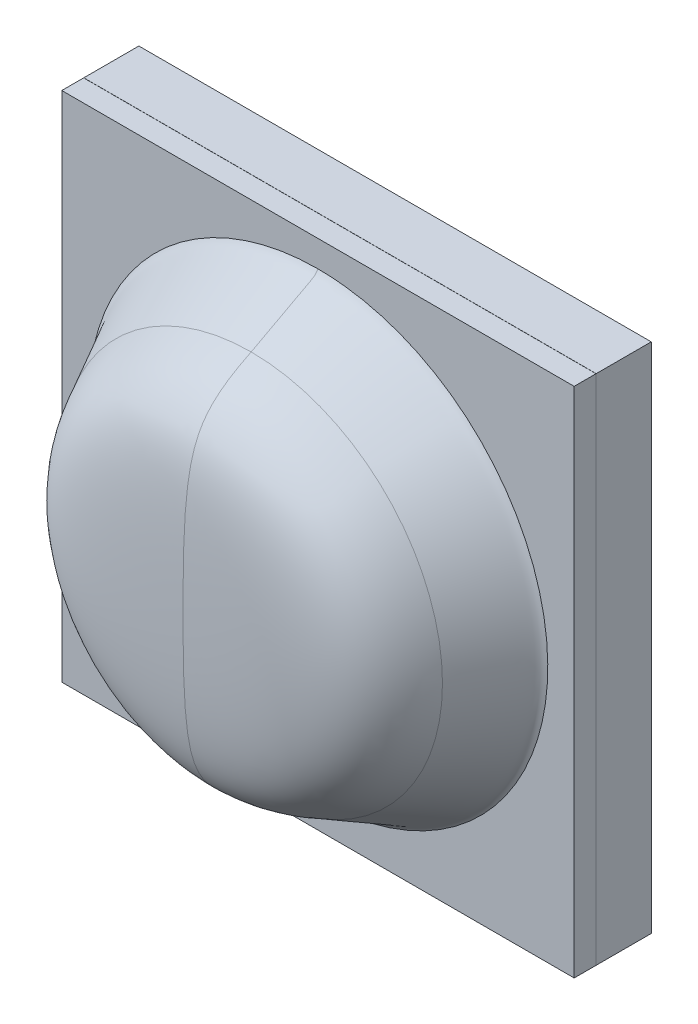
ISO-10303-21;
HEADER;
FILE_DESCRIPTION(('STEP AP214'),'2;1');
FILE_NAME('part.step','',(''),(''),'','','');
FILE_SCHEMA(('AUTOMOTIVE_DESIGN { 1 0 10303 214 1 1 1 1 }'));
ENDSEC;
DATA;
#1=APPLICATION_CONTEXT('core data for automotive mechanical design processes');
#2=APPLICATION_PROTOCOL_DEFINITION('international standard','automotive_design',2000,#1);
#3=PRODUCT_CONTEXT('',#1,'mechanical');
#4=PRODUCT('Part','Part','',(#3));
#5=PRODUCT_RELATED_PRODUCT_CATEGORY('part','',(#4));
#6=PRODUCT_DEFINITION_FORMATION('','',#4);
#7=PRODUCT_DEFINITION_CONTEXT('part definition',#1,'design');
#8=PRODUCT_DEFINITION('design','',#6,#7);
#9=PRODUCT_DEFINITION_SHAPE('','',#8);
#10=(LENGTH_UNIT() NAMED_UNIT(*) SI_UNIT(.MILLI.,.METRE.));
#11=(NAMED_UNIT(*) PLANE_ANGLE_UNIT() SI_UNIT($,.RADIAN.));
#12=(NAMED_UNIT(*) SI_UNIT($,.STERADIAN.) SOLID_ANGLE_UNIT());
#13=UNCERTAINTY_MEASURE_WITH_UNIT(LENGTH_MEASURE(1.E-05),#10,'distance_accuracy_value','');
#14=(GEOMETRIC_REPRESENTATION_CONTEXT(3) GLOBAL_UNCERTAINTY_ASSIGNED_CONTEXT((#13)) GLOBAL_UNIT_ASSIGNED_CONTEXT((#10,
#11,#12)) REPRESENTATION_CONTEXT('',''));
#15=CARTESIAN_POINT('',(0.,0.,0.));
#16=DIRECTION('',(0.,0.,1.));
#17=DIRECTION('',(1.,0.,0.));
#18=AXIS2_PLACEMENT_3D('',#15,#16,#17);
#19=CARTESIAN_POINT('',(0.,0.,1.55299));
#20=CARTESIAN_POINT('',(0.,0.,1.55299));
#21=CARTESIAN_POINT('',(0.,0.,1.55299));
#22=CARTESIAN_POINT('',(0.,0.,1.55299));
#23=CARTESIAN_POINT('',(0.,1.156,1.55299));
#24=CARTESIAN_POINT('',(-2.312,1.156,1.55299));
#25=CARTESIAN_POINT('',(-2.312,-1.156,1.55299));
#26=CARTESIAN_POINT('',(0.,-1.156,1.55299));
#27=CARTESIAN_POINT('',(0.,1.4,1.05299));
#28=CARTESIAN_POINT('',(-2.8,1.4,1.05299));
#29=CARTESIAN_POINT('',(-2.8,-1.4,1.05299));
#30=CARTESIAN_POINT('',(0.,-1.4,1.05299));
#31=(BOUNDED_SURFACE() B_SPLINE_SURFACE(2,3,((#19,#20,#21,#22),(#23,#24,#25,#26),(#27,#28,#29,
#30)),.UNSPECIFIED.,.F.,.F.,.F.) B_SPLINE_SURFACE_WITH_KNOTS((3,3),(4,4),(-1.,0.),(0.,1.),
.UNSPECIFIED.) GEOMETRIC_REPRESENTATION_ITEM() RATIONAL_B_SPLINE_SURFACE(((1.,0.333333333333334,
0.333333333333334,1.),(1.94117647058824,0.647058823529413,0.647058823529413,1.94117647058824),
(1.,0.333333333333334,0.333333333333334,1.))) REPRESENTATION_ITEM('') SURFACE());
#32=CARTESIAN_POINT('',(0.,0.,1.55299));
#33=CARTESIAN_POINT('',(0.,-1.156,1.55299));
#34=CARTESIAN_POINT('',(0.,-1.4,1.053));
#35=(BOUNDED_CURVE() B_SPLINE_CURVE(2,(#32,#33,#34),.UNSPECIFIED.,.F.,
.F.) B_SPLINE_CURVE_WITH_KNOTS((3,3),(-1.,0.),
.UNSPECIFIED.) CURVE() GEOMETRIC_REPRESENTATION_ITEM() RATIONAL_B_SPLINE_CURVE((1.,
1.94117647058824,1.)) REPRESENTATION_ITEM(''));
#36=CARTESIAN_POINT('',(0.,0.,1.55299));
#37=VERTEX_POINT('',#36);
#38=CARTESIAN_POINT('',(0.,-1.4,1.053));
#39=VERTEX_POINT('',#38);
#40=EDGE_CURVE('E197',#37,#39,#35,.T.);
#41=CARTESIAN_POINT('',(0.,0.,1.55299));
#42=CARTESIAN_POINT('',(0.,1.156,1.55299));
#43=CARTESIAN_POINT('',(0.,1.4,1.053));
#44=(BOUNDED_CURVE() B_SPLINE_CURVE(2,(#41,#42,#43),.UNSPECIFIED.,.F.,
.F.) B_SPLINE_CURVE_WITH_KNOTS((3,3),(-1.,0.),
.UNSPECIFIED.) CURVE() GEOMETRIC_REPRESENTATION_ITEM() RATIONAL_B_SPLINE_CURVE((1.,
1.94117647058824,1.)) REPRESENTATION_ITEM(''));
#45=CARTESIAN_POINT('',(0.,1.4,1.053));
#46=VERTEX_POINT('',#45);
#47=EDGE_CURVE('E207',#37,#46,#44,.T.);
#48=CARTESIAN_POINT('',(0.,0.,1.053));
#49=DIRECTION('',(0.,0.,-1.));
#50=DIRECTION('',(0.,1.,0.));
#51=AXIS2_PLACEMENT_3D('',#48,#49,#50);
#52=CIRCLE('',#51,1.4);
#53=EDGE_CURVE('E10',#39,#46,#52,.T.);
#54=ORIENTED_EDGE('',*,*,#40,.F.);
#55=ORIENTED_EDGE('',*,*,#47,.T.);
#56=ORIENTED_EDGE('',*,*,#53,.F.);
#57=EDGE_LOOP('',(#54,#55,#56));
#58=FACE_BOUND('',#57,.T.);
#59=ADVANCED_FACE('F15',(#58),#31,.T.);
#60=CARTESIAN_POINT('',(0.,1.4,1.053));
#61=CARTESIAN_POINT('',(-2.8,1.4,1.053));
#62=CARTESIAN_POINT('',(-2.8,-1.4,1.053));
#63=CARTESIAN_POINT('',(0.,-1.4,1.053));
#64=CARTESIAN_POINT('',(0.,1.64871701198194,0.585412017473941));
#65=CARTESIAN_POINT('',(-3.29743402396389,1.64871701198195,0.585412017473941));
#66=CARTESIAN_POINT('',(-3.29743402396389,-1.64871701198195,0.585412017473941));
#67=CARTESIAN_POINT('',(0.,-1.64871701198194,0.585412017473941));
#68=CARTESIAN_POINT('',(0.,1.68189867190232,0.564155041236885));
#69=CARTESIAN_POINT('',(-3.36379734380464,1.68189867190232,0.564155041236885));
#70=CARTESIAN_POINT('',(-3.36379734380464,-1.68189867190232,0.564155041236885));
#71=CARTESIAN_POINT('',(0.,-1.68189867190232,0.564155041236885));
#72=(BOUNDED_SURFACE() B_SPLINE_SURFACE(2,3,((#60,#61,#62,#63),(#64,#65,#66,#67),(#68,#69,#70,
#71)),.UNSPECIFIED.,.F.,.F.,.F.) B_SPLINE_SURFACE_WITH_KNOTS((3,3),(4,4),(-1.,
-0.0364496165242492),(0.,1.),
.UNSPECIFIED.) GEOMETRIC_REPRESENTATION_ITEM() RATIONAL_B_SPLINE_SURFACE(((1.,0.333333333333334,
0.333333333333334,1.),(7.10248576201309,2.36749525400436,2.36749525400436,7.10248576201309),
(1.44486653174013,0.481622177246712,0.481622177246712,1.44486653174013))) REPRESENTATION_ITEM('') SURFACE());
#73=CARTESIAN_POINT('',(0.,-1.4,1.053));
#74=CARTESIAN_POINT('',(0.,-1.64871701198195,0.585412017473942));
#75=CARTESIAN_POINT('',(0.,-1.68189867190232,0.564155041236885));
#76=(BOUNDED_CURVE() B_SPLINE_CURVE(2,(#73,#74,#75),.UNSPECIFIED.,.F.,
.F.) B_SPLINE_CURVE_WITH_KNOTS((3,3),(-1.,-0.0364496165242487),
.UNSPECIFIED.) CURVE() GEOMETRIC_REPRESENTATION_ITEM() RATIONAL_B_SPLINE_CURVE((1.,
7.10248576201309,1.44486653174013)) REPRESENTATION_ITEM(''));
#77=CARTESIAN_POINT('',(0.,-1.68189867190231,0.564155041236885));
#78=VERTEX_POINT('',#77);
#79=EDGE_CURVE('E367',#39,#78,#76,.T.);
#80=CARTESIAN_POINT('',(0.,1.4,1.053));
#81=CARTESIAN_POINT('',(0.,1.64871701198195,0.585412017473942));
#82=CARTESIAN_POINT('',(0.,1.68189867190232,0.564155041236885));
#83=(BOUNDED_CURVE() B_SPLINE_CURVE(2,(#80,#81,#82),.UNSPECIFIED.,.F.,
.F.) B_SPLINE_CURVE_WITH_KNOTS((3,3),(-1.,-0.0364496165242504),
.UNSPECIFIED.) CURVE() GEOMETRIC_REPRESENTATION_ITEM() RATIONAL_B_SPLINE_CURVE((1.,
7.10248576201308,1.44486653174015)) REPRESENTATION_ITEM(''));
#84=CARTESIAN_POINT('',(0.,1.68189867190232,0.564155041236885));
#85=VERTEX_POINT('',#84);
#86=EDGE_CURVE('E212',#46,#85,#83,.T.);
#87=CARTESIAN_POINT('',(0.,1.68189867190232,0.564155041236885));
#88=CARTESIAN_POINT('',(-3.36379734380463,1.68189867190232,0.564155041236885));
#89=CARTESIAN_POINT('',(-3.36379734380463,-1.68189867190232,0.564155041236885));
#90=CARTESIAN_POINT('',(0.,-1.68189867190231,0.564155041236885));
#91=(BOUNDED_CURVE() B_SPLINE_CURVE(3,(#87,#88,#89,#90),.UNSPECIFIED.,.F.,
.F.) B_SPLINE_CURVE_WITH_KNOTS((4,4),(0.,0.5),
.UNSPECIFIED.) CURVE() GEOMETRIC_REPRESENTATION_ITEM() RATIONAL_B_SPLINE_CURVE((1.,
0.333333333333334,0.333333333333334,1.)) REPRESENTATION_ITEM(''));
#92=EDGE_CURVE('E28',#85,#78,#91,.T.);
#93=ORIENTED_EDGE('',*,*,#79,.F.);
#94=ORIENTED_EDGE('',*,*,#53,.T.);
#95=ORIENTED_EDGE('',*,*,#86,.T.);
#96=ORIENTED_EDGE('',*,*,#92,.T.);
#97=EDGE_LOOP('',(#93,#94,#95,#96));
#98=FACE_BOUND('',#97,.T.);
#99=ADVANCED_FACE('F414',(#98),#72,.T.);
#100=CARTESIAN_POINT('',(1.875,-1.875,0.564155041236885));
#101=DIRECTION('',(0.,0.,-1.));
#102=DIRECTION('',(0.,-1.,0.));
#103=AXIS2_PLACEMENT_3D('',#100,#101,#102);
#104=PLANE('',#103);
#105=ORIENTED_EDGE('',*,*,#92,.F.);
#106=CARTESIAN_POINT('',(0.,-1.68189867190231,0.564155041236885));
#107=CARTESIAN_POINT('',(3.36379734380463,-1.68189867190232,0.564155041236885));
#108=CARTESIAN_POINT('',(3.36379734380463,1.68189867190232,0.564155041236885));
#109=CARTESIAN_POINT('',(0.,1.68189867190232,0.564155041236885));
#110=(BOUNDED_CURVE() B_SPLINE_CURVE(3,(#106,#107,#108,#109),.UNSPECIFIED.,.F.,
.F.) B_SPLINE_CURVE_WITH_KNOTS((4,4),(0.5,1.),
.UNSPECIFIED.) CURVE() GEOMETRIC_REPRESENTATION_ITEM() RATIONAL_B_SPLINE_CURVE((1.,
0.333333333333334,0.333333333333334,1.)) REPRESENTATION_ITEM(''));
#111=EDGE_CURVE('E217',#78,#85,#110,.T.);
#112=ORIENTED_EDGE('',*,*,#111,.F.);
#113=EDGE_LOOP('',(#105,#112));
#114=FACE_BOUND('',#113,.T.);
#115=DIRECTION('',(0.,-1.,0.));
#116=VECTOR('',#115,1.);
#117=CARTESIAN_POINT('',(1.875,1.875,0.564155041236885));
#118=LINE('',#117,#116);
#119=CARTESIAN_POINT('',(1.875,1.875,0.564155041236885));
#120=VERTEX_POINT('',#119);
#121=CARTESIAN_POINT('',(1.875,-1.875,0.564155041236885));
#122=VERTEX_POINT('',#121);
#123=EDGE_CURVE('E329',#120,#122,#118,.T.);
#124=ORIENTED_EDGE('',*,*,#123,.F.);
#125=DIRECTION('',(1.,0.,0.));
#126=VECTOR('',#125,1.);
#127=CARTESIAN_POINT('',(-1.875,1.875,0.564155041236885));
#128=LINE('',#127,#126);
#129=CARTESIAN_POINT('',(-1.875,1.875,0.564155041236885));
#130=VERTEX_POINT('',#129);
#131=EDGE_CURVE('E151',#130,#120,#128,.T.);
#132=ORIENTED_EDGE('',*,*,#131,.F.);
#133=DIRECTION('',(0.,1.,0.));
#134=VECTOR('',#133,1.);
#135=CARTESIAN_POINT('',(-1.875,1.875,0.564155041236885));
#136=LINE('',#135,#134);
#137=CARTESIAN_POINT('',(-1.875,-1.875,0.564155041236885));
#138=VERTEX_POINT('',#137);
#139=EDGE_CURVE('E222',#138,#130,#136,.T.);
#140=ORIENTED_EDGE('',*,*,#139,.F.);
#141=DIRECTION('',(-1.,0.,0.));
#142=VECTOR('',#141,1.);
#143=CARTESIAN_POINT('',(-1.875,-1.875,0.564155041236885));
#144=LINE('',#143,#142);
#145=EDGE_CURVE('E43',#122,#138,#144,.T.);
#146=ORIENTED_EDGE('',*,*,#145,.F.);
#147=EDGE_LOOP('',(#124,#132,#140,#146));
#148=FACE_BOUND('',#147,.T.);
#149=ADVANCED_FACE('F421',(#114,#148),#104,.F.);
#150=CARTESIAN_POINT('',(-1.875,-1.875,0.404155041236885));
#151=DIRECTION('',(0.,-1.,0.));
#152=DIRECTION('',(-1.,0.,0.));
#153=AXIS2_PLACEMENT_3D('',#150,#151,#152);
#154=PLANE('',#153);
#155=DIRECTION('',(-1.,0.,0.));
#156=VECTOR('',#155,1.);
#157=CARTESIAN_POINT('',(1.875,-1.875,0.404155041236885));
#158=LINE('',#157,#156);
#159=CARTESIAN_POINT('',(1.875,-1.875,0.404155041236885));
#160=VERTEX_POINT('',#159);
#161=CARTESIAN_POINT('',(-1.875,-1.875,0.404155041236885));
#162=VERTEX_POINT('',#161);
#163=EDGE_CURVE('E325',#160,#162,#158,.T.);
#164=ORIENTED_EDGE('',*,*,#163,.F.);
#165=DIRECTION('',(0.,0.,-1.));
#166=VECTOR('',#165,1.);
#167=CARTESIAN_POINT('',(1.875,-1.875,0.404155041236885));
#168=LINE('',#167,#166);
#169=EDGE_CURVE('E326',#122,#160,#168,.T.);
#170=ORIENTED_EDGE('',*,*,#169,.F.);
#171=ORIENTED_EDGE('',*,*,#145,.T.);
#172=DIRECTION('',(0.,0.,1.));
#173=VECTOR('',#172,1.);
#174=CARTESIAN_POINT('',(-1.875,-1.875,0.404155041236885));
#175=LINE('',#174,#173);
#176=EDGE_CURVE('E160',#162,#138,#175,.T.);
#177=ORIENTED_EDGE('',*,*,#176,.F.);
#178=EDGE_LOOP('',(#164,#170,#171,#177));
#179=FACE_BOUND('',#178,.T.);
#180=ADVANCED_FACE('F426',(#179),#154,.T.);
#181=CARTESIAN_POINT('',(-1.875,1.875,0.404155041236885));
#182=DIRECTION('',(-1.,0.,0.));
#183=DIRECTION('',(0.,0.,1.));
#184=AXIS2_PLACEMENT_3D('',#181,#182,#183);
#185=PLANE('',#184);
#186=DIRECTION('',(0.,1.,0.));
#187=VECTOR('',#186,1.);
#188=CARTESIAN_POINT('',(-1.875,-1.875,0.404155041236885));
#189=LINE('',#188,#187);
#190=CARTESIAN_POINT('',(-1.875,1.875,0.404155041236885));
#191=VERTEX_POINT('',#190);
#192=EDGE_CURVE('E322',#162,#191,#189,.T.);
#193=ORIENTED_EDGE('',*,*,#192,.F.);
#194=ORIENTED_EDGE('',*,*,#176,.T.);
#195=ORIENTED_EDGE('',*,*,#139,.T.);
#196=DIRECTION('',(0.,0.,1.));
#197=VECTOR('',#196,1.);
#198=CARTESIAN_POINT('',(-1.875,1.875,0.404155041236885));
#199=LINE('',#198,#197);
#200=EDGE_CURVE('E123',#191,#130,#199,.T.);
#201=ORIENTED_EDGE('',*,*,#200,.F.);
#202=EDGE_LOOP('',(#193,#194,#195,#201));
#203=FACE_BOUND('',#202,.T.);
#204=ADVANCED_FACE('F17',(#203),#185,.T.);
#205=CARTESIAN_POINT('',(-1.875,1.875,0.404155041236885));
#206=DIRECTION('',(0.,1.,0.));
#207=DIRECTION('',(1.,0.,0.));
#208=AXIS2_PLACEMENT_3D('',#205,#206,#207);
#209=PLANE('',#208);
#210=DIRECTION('',(1.,0.,0.));
#211=VECTOR('',#210,1.);
#212=CARTESIAN_POINT('',(1.875,1.875,0.404155041236885));
#213=LINE('',#212,#211);
#214=CARTESIAN_POINT('',(1.875,1.875,0.404155041236885));
#215=VERTEX_POINT('',#214);
#216=EDGE_CURVE('E301',#191,#215,#213,.T.);
#217=ORIENTED_EDGE('',*,*,#216,.F.);
#218=ORIENTED_EDGE('',*,*,#200,.T.);
#219=ORIENTED_EDGE('',*,*,#131,.T.);
#220=DIRECTION('',(0.,0.,1.));
#221=VECTOR('',#220,1.);
#222=CARTESIAN_POINT('',(1.875,1.875,0.404155041236885));
#223=LINE('',#222,#221);
#224=EDGE_CURVE('E324',#215,#120,#223,.T.);
#225=ORIENTED_EDGE('',*,*,#224,.F.);
#226=EDGE_LOOP('',(#217,#218,#219,#225));
#227=FACE_BOUND('',#226,.T.);
#228=ADVANCED_FACE('F431',(#227),#209,.T.);
#229=CARTESIAN_POINT('',(1.875,1.875,0.404155041236885));
#230=DIRECTION('',(1.,0.,0.));
#231=DIRECTION('',(0.,1.,0.));
#232=AXIS2_PLACEMENT_3D('',#229,#230,#231);
#233=PLANE('',#232);
#234=DIRECTION('',(0.,-1.,0.));
#235=VECTOR('',#234,1.);
#236=CARTESIAN_POINT('',(1.875,-1.875,0.404155041236885));
#237=LINE('',#236,#235);
#238=EDGE_CURVE('E335',#215,#160,#237,.T.);
#239=ORIENTED_EDGE('',*,*,#238,.F.);
#240=ORIENTED_EDGE('',*,*,#224,.T.);
#241=ORIENTED_EDGE('',*,*,#123,.T.);
#242=ORIENTED_EDGE('',*,*,#169,.T.);
#243=EDGE_LOOP('',(#239,#240,#241,#242));
#244=FACE_BOUND('',#243,.T.);
#245=ADVANCED_FACE('F240',(#244),#233,.T.);
#246=CARTESIAN_POINT('',(1.875,-1.875,0.404155041236885));
#247=DIRECTION('',(0.,0.,-1.));
#248=DIRECTION('',(0.,-1.,0.));
#249=AXIS2_PLACEMENT_3D('',#246,#247,#248);
#250=PLANE('',#249);
#251=CARTESIAN_POINT('',(1.8,1.8,0.404155041236885));
#252=DIRECTION('',(-1.,0.,0.));
#253=VECTOR('',#252,1.);
#254=LINE('',#251,#253);
#255=CARTESIAN_POINT('',(1.8,1.8,0.403577520618446));
#256=VERTEX_POINT('',#255);
#257=CARTESIAN_POINT('',(-1.8,1.8,0.403577520618446));
#258=VERTEX_POINT('',#257);
#259=EDGE_CURVE('E294',#256,#258,#254,.T.);
#260=ORIENTED_EDGE('',*,*,#259,.T.);
#261=CARTESIAN_POINT('',(-1.8,1.8,0.404155041236885));
#262=DIRECTION('',(0.,-1.,0.));
#263=VECTOR('',#262,1.);
#264=LINE('',#261,#263);
#265=CARTESIAN_POINT('',(-1.8,-1.8,0.403577520618446));
#266=VERTEX_POINT('',#265);
#267=EDGE_CURVE('E268',#258,#266,#264,.T.);
#268=ORIENTED_EDGE('',*,*,#267,.T.);
#269=CARTESIAN_POINT('',(-1.8,-1.8,0.404155041236885));
#270=DIRECTION('',(1.,0.,0.));
#271=VECTOR('',#270,1.);
#272=LINE('',#269,#271);
#273=CARTESIAN_POINT('',(1.8,-1.8,0.403577520618446));
#274=VERTEX_POINT('',#273);
#275=EDGE_CURVE('E303',#266,#274,#272,.T.);
#276=ORIENTED_EDGE('',*,*,#275,.T.);
#277=CARTESIAN_POINT('',(1.8,-1.8,0.404155041236885));
#278=DIRECTION('',(0.,1.,0.));
#279=VECTOR('',#278,1.);
#280=LINE('',#277,#279);
#281=EDGE_CURVE('E138',#274,#256,#280,.T.);
#282=ORIENTED_EDGE('',*,*,#281,.T.);
#283=EDGE_LOOP('',(#260,#268,#276,#282));
#284=FACE_BOUND('',#283,.T.);
#285=ORIENTED_EDGE('',*,*,#216,.T.);
#286=ORIENTED_EDGE('',*,*,#238,.T.);
#287=ORIENTED_EDGE('',*,*,#163,.T.);
#288=ORIENTED_EDGE('',*,*,#192,.T.);
#289=EDGE_LOOP('',(#285,#286,#287,#288));
#290=FACE_BOUND('',#289,.T.);
#291=ADVANCED_FACE('F229',(#284,#290),#250,.T.);
#292=CARTESIAN_POINT('',(1.562144203303,0.65,0.403000000000008));
#293=DIRECTION('',(0.,0.,-1.));
#294=DIRECTION('',(0.,-1.,0.));
#295=AXIS2_PLACEMENT_3D('',#292,#293,#294);
#296=PLANE('',#295);
#297=ORIENTED_EDGE('',*,*,#275,.F.);
#298=ORIENTED_EDGE('',*,*,#267,.F.);
#299=ORIENTED_EDGE('',*,*,#259,.F.);
#300=ORIENTED_EDGE('',*,*,#281,.F.);
#301=EDGE_LOOP('',(#297,#298,#299,#300));
#302=FACE_BOUND('',#301,.T.);
#303=DIRECTION('',(0.,1.,0.));
#304=VECTOR('',#303,1.);
#305=CARTESIAN_POINT('',(1.875,-1.875,0.403000000000005));
#306=LINE('',#305,#304);
#307=CARTESIAN_POINT('',(1.875,-1.875,0.403000000000006));
#308=VERTEX_POINT('',#307);
#309=CARTESIAN_POINT('',(1.875,1.875,0.403000000000006));
#310=VERTEX_POINT('',#309);
#311=EDGE_CURVE('E91',#308,#310,#306,.T.);
#312=ORIENTED_EDGE('',*,*,#311,.T.);
#313=DIRECTION('',(-1.,0.,0.));
#314=VECTOR('',#313,1.);
#315=CARTESIAN_POINT('',(-1.875,1.875,0.403000000000005));
#316=LINE('',#315,#314);
#317=CARTESIAN_POINT('',(-1.875,1.875,0.403000000000006));
#318=VERTEX_POINT('',#317);
#319=EDGE_CURVE('E177',#310,#318,#316,.T.);
#320=ORIENTED_EDGE('',*,*,#319,.T.);
#321=DIRECTION('',(0.,-1.,0.));
#322=VECTOR('',#321,1.);
#323=CARTESIAN_POINT('',(-1.875,-1.875,0.403000000000005));
#324=LINE('',#323,#322);
#325=CARTESIAN_POINT('',(-1.875,-1.875,0.403000000000006));
#326=VERTEX_POINT('',#325);
#327=EDGE_CURVE('E74',#318,#326,#324,.T.);
#328=ORIENTED_EDGE('',*,*,#327,.T.);
#329=DIRECTION('',(1.,0.,0.));
#330=VECTOR('',#329,1.);
#331=CARTESIAN_POINT('',(-1.875,-1.875,0.403000000000005));
#332=LINE('',#331,#330);
#333=EDGE_CURVE('E375',#326,#308,#332,.T.);
#334=ORIENTED_EDGE('',*,*,#333,.T.);
#335=EDGE_LOOP('',(#312,#320,#328,#334));
#336=FACE_BOUND('',#335,.T.);
#337=ADVANCED_FACE('F239',(#302,#336),#296,.F.);
#338=CARTESIAN_POINT('',(-1.875,-1.875,0.403));
#339=DIRECTION('',(1.,0.,0.));
#340=DIRECTION('',(0.,1.,0.));
#341=AXIS2_PLACEMENT_3D('',#338,#339,#340);
#342=PLANE('',#341);
#343=DIRECTION('',(0.,0.,1.));
#344=VECTOR('',#343,1.);
#345=CARTESIAN_POINT('',(-1.875,-1.875,0.403));
#346=LINE('',#345,#344);
#347=CARTESIAN_POINT('',(-1.875,-1.875,0.));
#348=VERTEX_POINT('',#347);
#349=EDGE_CURVE('E180',#348,#326,#346,.T.);
#350=ORIENTED_EDGE('',*,*,#349,.T.);
#351=ORIENTED_EDGE('',*,*,#327,.F.);
#352=DIRECTION('',(0.,0.,-1.));
#353=VECTOR('',#352,1.);
#354=CARTESIAN_POINT('',(-1.875,1.875,0.403));
#355=LINE('',#354,#353);
#356=CARTESIAN_POINT('',(-1.875,1.875,0.));
#357=VERTEX_POINT('',#356);
#358=EDGE_CURVE('E318',#318,#357,#355,.T.);
#359=ORIENTED_EDGE('',*,*,#358,.T.);
#360=DIRECTION('',(0.,1.,0.));
#361=VECTOR('',#360,1.);
#362=CARTESIAN_POINT('',(-1.875,-1.875,0.));
#363=LINE('',#362,#361);
#364=EDGE_CURVE('E188',#348,#357,#363,.T.);
#365=ORIENTED_EDGE('',*,*,#364,.F.);
#366=EDGE_LOOP('',(#350,#351,#359,#365));
#367=FACE_BOUND('',#366,.T.);
#368=ADVANCED_FACE('F280',(#367),#342,.F.);
#369=CARTESIAN_POINT('',(-1.875,1.875,0.403));
#370=DIRECTION('',(0.,-1.,0.));
#371=DIRECTION('',(0.,0.,-1.));
#372=AXIS2_PLACEMENT_3D('',#369,#370,#371);
#373=PLANE('',#372);
#374=ORIENTED_EDGE('',*,*,#358,.F.);
#375=ORIENTED_EDGE('',*,*,#319,.F.);
#376=DIRECTION('',(0.,0.,-1.));
#377=VECTOR('',#376,1.);
#378=CARTESIAN_POINT('',(1.875,1.875,0.403));
#379=LINE('',#378,#377);
#380=CARTESIAN_POINT('',(1.875,1.875,0.));
#381=VERTEX_POINT('',#380);
#382=EDGE_CURVE('E171',#310,#381,#379,.T.);
#383=ORIENTED_EDGE('',*,*,#382,.T.);
#384=DIRECTION('',(1.,0.,0.));
#385=VECTOR('',#384,1.);
#386=CARTESIAN_POINT('',(1.875,1.875,0.));
#387=LINE('',#386,#385);
#388=EDGE_CURVE('E175',#357,#381,#387,.T.);
#389=ORIENTED_EDGE('',*,*,#388,.F.);
#390=EDGE_LOOP('',(#374,#375,#383,#389));
#391=FACE_BOUND('',#390,.T.);
#392=ADVANCED_FACE('F174',(#391),#373,.F.);
#393=CARTESIAN_POINT('',(1.875,-1.875,0.403));
#394=DIRECTION('',(-1.,0.,0.));
#395=DIRECTION('',(0.,0.,1.));
#396=AXIS2_PLACEMENT_3D('',#393,#394,#395);
#397=PLANE('',#396);
#398=ORIENTED_EDGE('',*,*,#382,.F.);
#399=ORIENTED_EDGE('',*,*,#311,.F.);
#400=DIRECTION('',(0.,0.,-1.));
#401=VECTOR('',#400,1.);
#402=CARTESIAN_POINT('',(1.875,-1.875,0.403));
#403=LINE('',#402,#401);
#404=CARTESIAN_POINT('',(1.875,-1.875,0.));
#405=VERTEX_POINT('',#404);
#406=EDGE_CURVE('E190',#308,#405,#403,.T.);
#407=ORIENTED_EDGE('',*,*,#406,.T.);
#408=DIRECTION('',(0.,-1.,0.));
#409=VECTOR('',#408,1.);
#410=CARTESIAN_POINT('',(1.875,-1.875,0.));
#411=LINE('',#410,#409);
#412=EDGE_CURVE('E186',#381,#405,#411,.T.);
#413=ORIENTED_EDGE('',*,*,#412,.F.);
#414=EDGE_LOOP('',(#398,#399,#407,#413));
#415=FACE_BOUND('',#414,.T.);
#416=ADVANCED_FACE('F192',(#415),#397,.F.);
#417=CARTESIAN_POINT('',(-1.875,-1.875,0.403));
#418=DIRECTION('',(0.,1.,0.));
#419=DIRECTION('',(1.,0.,0.));
#420=AXIS2_PLACEMENT_3D('',#417,#418,#419);
#421=PLANE('',#420);
#422=ORIENTED_EDGE('',*,*,#406,.F.);
#423=ORIENTED_EDGE('',*,*,#333,.F.);
#424=ORIENTED_EDGE('',*,*,#349,.F.);
#425=DIRECTION('',(-1.,0.,0.));
#426=VECTOR('',#425,1.);
#427=CARTESIAN_POINT('',(1.875,-1.875,0.));
#428=LINE('',#427,#426);
#429=EDGE_CURVE('E196',#405,#348,#428,.T.);
#430=ORIENTED_EDGE('',*,*,#429,.F.);
#431=EDGE_LOOP('',(#422,#423,#424,#430));
#432=FACE_BOUND('',#431,.T.);
#433=ADVANCED_FACE('F441',(#432),#421,.F.);
#434=CARTESIAN_POINT('',(1.875,-1.875,0.));
#435=DIRECTION('',(0.,0.,-1.));
#436=DIRECTION('',(-1.,0.,0.));
#437=AXIS2_PLACEMENT_3D('',#434,#435,#436);
#438=PLANE('',#437);
#439=ORIENTED_EDGE('',*,*,#412,.T.);
#440=ORIENTED_EDGE('',*,*,#429,.T.);
#441=ORIENTED_EDGE('',*,*,#364,.T.);
#442=ORIENTED_EDGE('',*,*,#388,.T.);
#443=EDGE_LOOP('',(#439,#440,#441,#442));
#444=FACE_BOUND('',#443,.T.);
#445=ADVANCED_FACE('F184',(#444),#438,.T.);
#446=CARTESIAN_POINT('',(0.,0.,1.55299));
#447=CARTESIAN_POINT('',(0.,0.,1.55299));
#448=CARTESIAN_POINT('',(0.,0.,1.55299));
#449=CARTESIAN_POINT('',(0.,0.,1.55299));
#450=CARTESIAN_POINT('',(0.,-1.156,1.55299));
#451=CARTESIAN_POINT('',(2.312,-1.156,1.55299));
#452=CARTESIAN_POINT('',(2.312,1.156,1.55299));
#453=CARTESIAN_POINT('',(0.,1.156,1.55299));
#454=CARTESIAN_POINT('',(0.,-1.4,1.05299));
#455=CARTESIAN_POINT('',(2.8,-1.4,1.05299));
#456=CARTESIAN_POINT('',(2.8,1.4,1.05299));
#457=CARTESIAN_POINT('',(0.,1.4,1.05299));
#458=(BOUNDED_SURFACE() B_SPLINE_SURFACE(2,3,((#446,#447,#448,#449),(#450,#451,#452,#453),(#454,
#455,#456,#457)),.UNSPECIFIED.,.F.,.F.,.F.) B_SPLINE_SURFACE_WITH_KNOTS((3,3),(4,4),(-1.,0.),
(0.,1.),.UNSPECIFIED.) GEOMETRIC_REPRESENTATION_ITEM() RATIONAL_B_SPLINE_SURFACE(((1.,
0.333333333333334,0.333333333333334,1.),(1.94117647058824,0.647058823529413,0.647058823529413,
1.94117647058824),(1.,0.333333333333334,0.333333333333334,1.))) REPRESENTATION_ITEM('') SURFACE());
#459=CARTESIAN_POINT('',(0.,0.,1.053));
#460=DIRECTION('',(0.,0.,-1.));
#461=DIRECTION('',(0.,1.,0.));
#462=AXIS2_PLACEMENT_3D('',#459,#460,#461);
#463=CIRCLE('',#462,1.4);
#464=EDGE_CURVE('E387',#46,#39,#463,.T.);
#465=ORIENTED_EDGE('',*,*,#47,.F.);
#466=ORIENTED_EDGE('',*,*,#40,.T.);
#467=ORIENTED_EDGE('',*,*,#464,.F.);
#468=EDGE_LOOP('',(#465,#466,#467));
#469=FACE_BOUND('',#468,.T.);
#470=ADVANCED_FACE('F411',(#469),#458,.T.);
#471=CARTESIAN_POINT('',(0.,-1.4,1.053));
#472=CARTESIAN_POINT('',(2.8,-1.4,1.053));
#473=CARTESIAN_POINT('',(2.8,1.4,1.053));
#474=CARTESIAN_POINT('',(0.,1.4,1.053));
#475=CARTESIAN_POINT('',(0.,-1.64871701198194,0.585412017473941));
#476=CARTESIAN_POINT('',(3.29743402396389,-1.64871701198195,0.585412017473941));
#477=CARTESIAN_POINT('',(3.29743402396389,1.64871701198195,0.585412017473941));
#478=CARTESIAN_POINT('',(0.,1.64871701198194,0.585412017473941));
#479=CARTESIAN_POINT('',(0.,-1.68189867190232,0.564155041236885));
#480=CARTESIAN_POINT('',(3.36379734380464,-1.68189867190232,0.564155041236885));
#481=CARTESIAN_POINT('',(3.36379734380464,1.68189867190232,0.564155041236885));
#482=CARTESIAN_POINT('',(0.,1.68189867190232,0.564155041236885));
#483=(BOUNDED_SURFACE() B_SPLINE_SURFACE(2,3,((#471,#472,#473,#474),(#475,#476,#477,#478),(#479,
#480,#481,#482)),.UNSPECIFIED.,.F.,.F.,.F.) B_SPLINE_SURFACE_WITH_KNOTS((3,3),(4,4),(-1.,
-0.0364496165242492),(0.,1.),
.UNSPECIFIED.) GEOMETRIC_REPRESENTATION_ITEM() RATIONAL_B_SPLINE_SURFACE(((1.,0.333333333333334,
0.333333333333334,1.),(7.10248576201309,2.36749525400436,2.36749525400436,7.10248576201309),
(1.44486653174013,0.481622177246712,0.481622177246712,1.44486653174013))) REPRESENTATION_ITEM('') SURFACE());
#484=ORIENTED_EDGE('',*,*,#464,.T.);
#485=ORIENTED_EDGE('',*,*,#79,.T.);
#486=ORIENTED_EDGE('',*,*,#111,.T.);
#487=ORIENTED_EDGE('',*,*,#86,.F.);
#488=EDGE_LOOP('',(#484,#485,#486,#487));
#489=FACE_BOUND('',#488,.T.);
#490=ADVANCED_FACE('F408',(#489),#483,.T.);
#491=CLOSED_SHELL('',(#59,#99,#149,#180,#204,#228,#245,#291,#337,#368,#392,#416,#433,#445,#470,#490));
#492=MANIFOLD_SOLID_BREP('B1',#491);
#493=ADVANCED_BREP_SHAPE_REPRESENTATION('',(#18,#492),#14);
#494=SHAPE_DEFINITION_REPRESENTATION(#9,#493);
ENDSEC;
END-ISO-10303-21;
